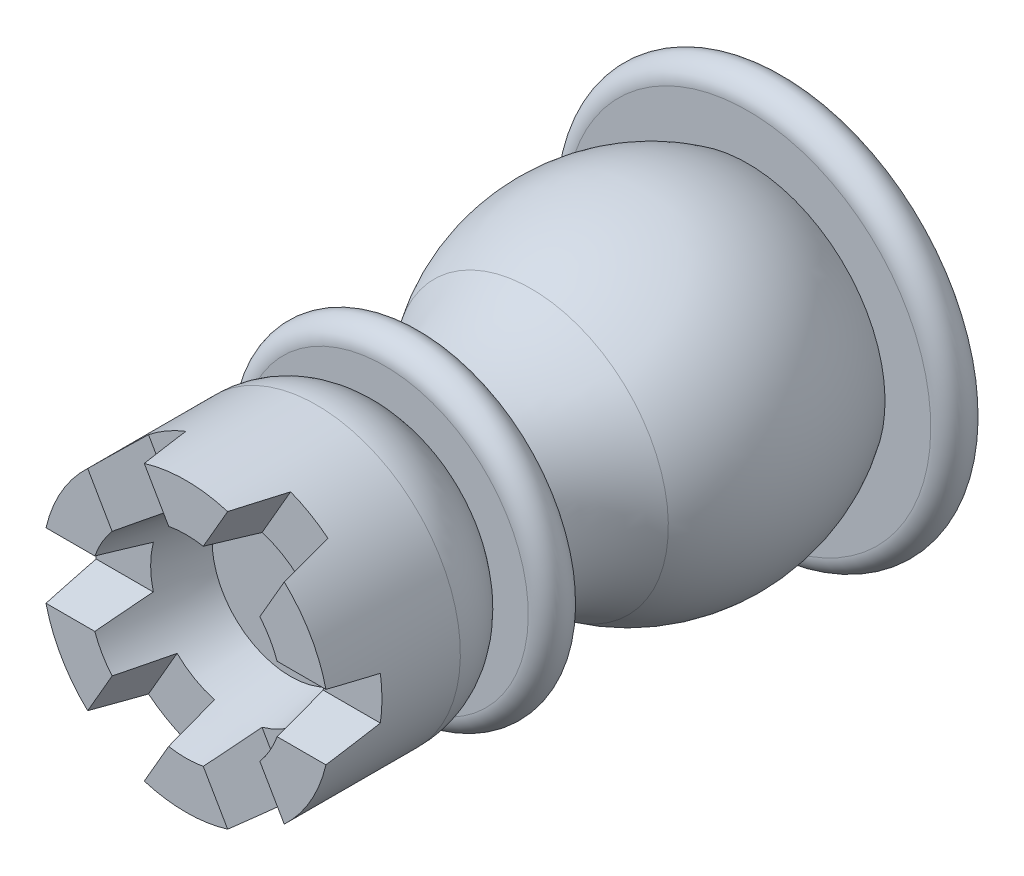
ISO-10303-21;
HEADER;
FILE_DESCRIPTION(('STEP AP214'),'2;1');
FILE_NAME('part.step','',(''),(''),'','','');
FILE_SCHEMA(('AUTOMOTIVE_DESIGN { 1 0 10303 214 1 1 1 1 }'));
ENDSEC;
DATA;
#1=APPLICATION_CONTEXT('core data for automotive mechanical design processes');
#2=APPLICATION_PROTOCOL_DEFINITION('international standard','automotive_design',2000,#1);
#3=PRODUCT_CONTEXT('',#1,'mechanical');
#4=PRODUCT('Part','Part','',(#3));
#5=PRODUCT_RELATED_PRODUCT_CATEGORY('part','',(#4));
#6=PRODUCT_DEFINITION_FORMATION('','',#4);
#7=PRODUCT_DEFINITION_CONTEXT('part definition',#1,'design');
#8=PRODUCT_DEFINITION('design','',#6,#7);
#9=PRODUCT_DEFINITION_SHAPE('','',#8);
#10=(LENGTH_UNIT() NAMED_UNIT(*) SI_UNIT(.MILLI.,.METRE.));
#11=(NAMED_UNIT(*) PLANE_ANGLE_UNIT() SI_UNIT($,.RADIAN.));
#12=(NAMED_UNIT(*) SI_UNIT($,.STERADIAN.) SOLID_ANGLE_UNIT());
#13=UNCERTAINTY_MEASURE_WITH_UNIT(LENGTH_MEASURE(1.E-05),#10,'distance_accuracy_value','');
#14=(GEOMETRIC_REPRESENTATION_CONTEXT(3) GLOBAL_UNCERTAINTY_ASSIGNED_CONTEXT((#13)) GLOBAL_UNIT_ASSIGNED_CONTEXT((#10,
#11,#12)) REPRESENTATION_CONTEXT('',''));
#15=CARTESIAN_POINT('',(0.,0.,0.));
#16=DIRECTION('',(0.,0.,1.));
#17=DIRECTION('',(1.,0.,0.));
#18=AXIS2_PLACEMENT_3D('',#15,#16,#17);
#19=CARTESIAN_POINT('',(0.,11.,46.));
#20=DIRECTION('',(0.,0.,-1.));
#21=DIRECTION('',(0.,1.,0.));
#22=AXIS2_PLACEMENT_3D('',#19,#20,#21);
#23=PLANE('',#22);
#24=DIRECTION('',(0.499999999999998,0.86602540378444,0.));
#25=VECTOR('',#24,1.);
#26=CARTESIAN_POINT('',(-8.42163336986825,-19.5866968793294,46.));
#27=LINE('',#26,#25);
#28=CARTESIAN_POINT('',(-3.19100781194602,-10.5269876576397,46.));
#29=VERTEX_POINT('',#28);
#30=CARTESIAN_POINT('',(-1.32303150114498,-7.29155777999727,46.));
#31=VERTEX_POINT('',#30);
#32=EDGE_CURVE('E218',#29,#31,#27,.T.);
#33=ORIENTED_EDGE('',*,*,#32,.F.);
#34=CARTESIAN_POINT('',(0.,0.,46.));
#35=DIRECTION('',(0.,0.,1.));
#36=DIRECTION('',(0.,-1.,0.));
#37=AXIS2_PLACEMENT_3D('',#34,#35,#36);
#38=CIRCLE('',#37,11.);
#39=CARTESIAN_POINT('',(3.19100781194609,-10.5269876576397,46.));
#40=VERTEX_POINT('',#39);
#41=EDGE_CURVE('E239',#29,#40,#38,.T.);
#42=ORIENTED_EDGE('',*,*,#41,.T.);
#43=DIRECTION('',(-0.500000000000004,0.866025403784436,0.));
#44=VECTOR('',#43,1.);
#45=CARTESIAN_POINT('',(8.42163336986841,-19.5866968793294,46.));
#46=LINE('',#45,#44);
#47=CARTESIAN_POINT('',(1.32303150114501,-7.29155777999722,46.));
#48=VERTEX_POINT('',#47);
#49=EDGE_CURVE('E465',#40,#48,#46,.T.);
#50=ORIENTED_EDGE('',*,*,#49,.T.);
#51=CARTESIAN_POINT('',(0.,0.,46.));
#52=DIRECTION('',(0.,0.,1.));
#53=DIRECTION('',(0.,-1.,0.));
#54=AXIS2_PLACEMENT_3D('',#51,#52,#53);
#55=CIRCLE('',#54,7.41061584566766);
#56=EDGE_CURVE('E253',#31,#48,#55,.T.);
#57=ORIENTED_EDGE('',*,*,#56,.F.);
#58=EDGE_LOOP('',(#33,#42,#50,#57));
#59=FACE_BOUND('',#58,.T.);
#60=ADVANCED_FACE('F44',(#59),#23,.F.);
#61=DIRECTION('',(-0.500000000000004,0.866025403784436,0.));
#62=VECTOR('',#61,1.);
#63=CARTESIAN_POINT('',(12.7517603887906,-17.0866968793294,46.));
#64=LINE('',#63,#62);
#65=CARTESIAN_POINT('',(7.52113483086827,-8.0269876576397,46.));
#66=VERTEX_POINT('',#65);
#67=CARTESIAN_POINT('',(5.65315852006721,-4.79155777999723,46.));
#68=VERTEX_POINT('',#67);
#69=EDGE_CURVE('E209',#66,#68,#64,.T.);
#70=ORIENTED_EDGE('',*,*,#69,.F.);
#71=CARTESIAN_POINT('',(10.7121426428143,-2.5,46.));
#72=VERTEX_POINT('',#71);
#73=EDGE_CURVE('E223',#66,#72,#38,.T.);
#74=ORIENTED_EDGE('',*,*,#73,.T.);
#75=DIRECTION('',(1.,0.,0.));
#76=VECTOR('',#75,1.);
#77=CARTESIAN_POINT('',(-15.5,-2.5,46.));
#78=LINE('',#77,#76);
#79=CARTESIAN_POINT('',(6.9761900212122,-2.5,46.));
#80=VERTEX_POINT('',#79);
#81=EDGE_CURVE('E317',#80,#72,#78,.T.);
#82=ORIENTED_EDGE('',*,*,#81,.F.);
#83=EDGE_CURVE('E230',#68,#80,#55,.T.);
#84=ORIENTED_EDGE('',*,*,#83,.F.);
#85=EDGE_LOOP('',(#70,#74,#82,#84));
#86=FACE_BOUND('',#85,.T.);
#87=ADVANCED_FACE('F224',(#86),#23,.F.);
#88=CARTESIAN_POINT('',(5.65315852006718,4.79155777999728,46.));
#89=VERTEX_POINT('',#88);
#90=CARTESIAN_POINT('',(7.52113483086821,8.02698765763974,46.));
#91=VERTEX_POINT('',#90);
#92=EDGE_CURVE('E453',#89,#91,#27,.T.);
#93=ORIENTED_EDGE('',*,*,#92,.F.);
#94=CARTESIAN_POINT('',(6.97619002121224,2.5,46.));
#95=VERTEX_POINT('',#94);
#96=EDGE_CURVE('E238',#95,#89,#55,.T.);
#97=ORIENTED_EDGE('',*,*,#96,.F.);
#98=DIRECTION('',(1.,0.,0.));
#99=VECTOR('',#98,1.);
#100=CARTESIAN_POINT('',(-15.5,2.5,46.));
#101=LINE('',#100,#99);
#102=CARTESIAN_POINT('',(10.7121426428143,2.5,46.));
#103=VERTEX_POINT('',#102);
#104=EDGE_CURVE('E322',#95,#103,#101,.T.);
#105=ORIENTED_EDGE('',*,*,#104,.T.);
#106=EDGE_CURVE('E254',#103,#91,#38,.T.);
#107=ORIENTED_EDGE('',*,*,#106,.T.);
#108=EDGE_LOOP('',(#93,#97,#105,#107));
#109=FACE_BOUND('',#108,.T.);
#110=ADVANCED_FACE('F500',(#109),#23,.F.);
#111=CARTESIAN_POINT('',(1.32303150114497,7.29155777999723,46.));
#112=VERTEX_POINT('',#111);
#113=CARTESIAN_POINT('',(-1.32303150114503,7.29155777999726,46.));
#114=VERTEX_POINT('',#113);
#115=EDGE_CURVE('E246',#112,#114,#55,.T.);
#116=ORIENTED_EDGE('',*,*,#115,.F.);
#117=DIRECTION('',(0.499999999999998,0.86602540378444,0.));
#118=VECTOR('',#117,1.);
#119=CARTESIAN_POINT('',(-12.7517603887905,-17.0866968793294,46.));
#120=LINE('',#119,#118);
#121=CARTESIAN_POINT('',(3.19100781194601,10.5269876576397,46.));
#122=VERTEX_POINT('',#121);
#123=EDGE_CURVE('E282',#112,#122,#120,.T.);
#124=ORIENTED_EDGE('',*,*,#123,.T.);
#125=CARTESIAN_POINT('',(-3.19100781194609,10.5269876576397,46.));
#126=VERTEX_POINT('',#125);
#127=EDGE_CURVE('E261',#122,#126,#38,.T.);
#128=ORIENTED_EDGE('',*,*,#127,.T.);
#129=EDGE_CURVE('E228',#114,#126,#64,.T.);
#130=ORIENTED_EDGE('',*,*,#129,.F.);
#131=EDGE_LOOP('',(#116,#124,#128,#130));
#132=FACE_BOUND('',#131,.T.);
#133=ADVANCED_FACE('F276',(#132),#23,.F.);
#134=CARTESIAN_POINT('',(-10.7121426428143,-2.5,46.));
#135=VERTEX_POINT('',#134);
#136=CARTESIAN_POINT('',(-7.52113483086822,-8.02698765763975,46.));
#137=VERTEX_POINT('',#136);
#138=EDGE_CURVE('E245',#135,#137,#38,.T.);
#139=ORIENTED_EDGE('',*,*,#138,.T.);
#140=CARTESIAN_POINT('',(-5.65315852006718,-4.79155777999728,46.));
#141=VERTEX_POINT('',#140);
#142=EDGE_CURVE('E449',#137,#141,#120,.T.);
#143=ORIENTED_EDGE('',*,*,#142,.T.);
#144=CARTESIAN_POINT('',(-6.9761900212122,-2.5,46.));
#145=VERTEX_POINT('',#144);
#146=EDGE_CURVE('E249',#145,#141,#55,.T.);
#147=ORIENTED_EDGE('',*,*,#146,.F.);
#148=EDGE_CURVE('E325',#135,#145,#78,.T.);
#149=ORIENTED_EDGE('',*,*,#148,.F.);
#150=EDGE_LOOP('',(#139,#143,#147,#149));
#151=FACE_BOUND('',#150,.T.);
#152=ADVANCED_FACE('F502',(#151),#23,.F.);
#153=CARTESIAN_POINT('',(0.,0.,0.));
#154=DIRECTION('',(0.,0.,1.));
#155=DIRECTION('',(0.,-1.,0.));
#156=AXIS2_PLACEMENT_3D('',#153,#154,#155);
#157=PLANE('',#156);
#158=CARTESIAN_POINT('',(0.,0.,0.));
#159=DIRECTION('',(0.,0.,1.));
#160=DIRECTION('',(0.,-1.,0.));
#161=AXIS2_PLACEMENT_3D('',#158,#159,#160);
#162=CIRCLE('',#161,14.);
#163=CARTESIAN_POINT('',(0.,-14.,0.));
#164=VERTEX_POINT('',#163);
#165=EDGE_CURVE('E541',#164,#164,#162,.T.);
#166=ORIENTED_EDGE('',*,*,#165,.F.);
#167=EDGE_LOOP('',(#166));
#168=FACE_BOUND('',#167,.T.);
#169=ADVANCED_FACE('F50',(#168),#157,.F.);
#170=CARTESIAN_POINT('',(0.,0.,1.5));
#171=DIRECTION('',(0.,0.,1.));
#172=DIRECTION('',(0.,-1.,0.));
#173=AXIS2_PLACEMENT_3D('',#170,#171,#172);
#174=TOROIDAL_SURFACE('',#173,14.,1.5);
#175=CARTESIAN_POINT('',(0.,0.,3.));
#176=DIRECTION('',(0.,0.,1.));
#177=DIRECTION('',(0.,-1.,0.));
#178=AXIS2_PLACEMENT_3D('',#175,#176,#177);
#179=CIRCLE('',#178,14.);
#180=CARTESIAN_POINT('',(0.,-14.,3.));
#181=VERTEX_POINT('',#180);
#182=EDGE_CURVE('E542',#181,#181,#179,.T.);
#183=ORIENTED_EDGE('',*,*,#182,.F.);
#184=EDGE_LOOP('',(#183));
#185=FACE_BOUND('',#184,.T.);
#186=ORIENTED_EDGE('',*,*,#165,.T.);
#187=EDGE_LOOP('',(#186));
#188=FACE_BOUND('',#187,.T.);
#189=ADVANCED_FACE('F511',(#185,#188),#174,.T.);
#190=CARTESIAN_POINT('',(0.,14.,3.));
#191=DIRECTION('',(0.,0.,-1.));
#192=DIRECTION('',(0.,1.,0.));
#193=AXIS2_PLACEMENT_3D('',#190,#191,#192);
#194=PLANE('',#193);
#195=CARTESIAN_POINT('',(0.,0.,3.));
#196=DIRECTION('',(0.,0.,1.));
#197=DIRECTION('',(0.,-1.,0.));
#198=AXIS2_PLACEMENT_3D('',#195,#196,#197);
#199=CIRCLE('',#198,10.5);
#200=CARTESIAN_POINT('',(0.,-10.5,3.));
#201=VERTEX_POINT('',#200);
#202=EDGE_CURVE('E549',#201,#201,#199,.T.);
#203=ORIENTED_EDGE('',*,*,#202,.F.);
#204=EDGE_LOOP('',(#203));
#205=FACE_BOUND('',#204,.T.);
#206=ORIENTED_EDGE('',*,*,#182,.T.);
#207=EDGE_LOOP('',(#206));
#208=FACE_BOUND('',#207,.T.);
#209=ADVANCED_FACE('F605',(#205,#208),#194,.F.);
#210=CARTESIAN_POINT('',(0.,0.,11.2915619761802));
#211=DIRECTION('',(0.,0.,1.));
#212=DIRECTION('',(0.,-1.,0.));
#213=AXIS2_PLACEMENT_3D('',#210,#211,#212);
#214=DEGENERATE_TOROIDAL_SURFACE('',#213,1.99999999980648,15.,.F.);
#215=CARTESIAN_POINT('',(0.,0.,19.5832509410501));
#216=DIRECTION('',(0.,0.,1.));
#217=DIRECTION('',(0.,-1.,0.));
#218=AXIS2_PLACEMENT_3D('',#215,#216,#217);
#219=CIRCLE('',#218,10.4999157643039);
#220=CARTESIAN_POINT('',(0.,-10.4999157643039,19.5832509410501));
#221=VERTEX_POINT('',#220);
#222=EDGE_CURVE('E551',#221,#221,#219,.T.);
#223=ORIENTED_EDGE('',*,*,#222,.F.);
#224=EDGE_LOOP('',(#223));
#225=FACE_BOUND('',#224,.T.);
#226=ORIENTED_EDGE('',*,*,#202,.T.);
#227=EDGE_LOOP('',(#226));
#228=FACE_BOUND('',#227,.T.);
#229=ADVANCED_FACE('F596',(#225,#228),#214,.F.);
#230=CARTESIAN_POINT('',(0.,0.,27.87493990592));
#231=DIRECTION('',(0.,0.,1.));
#232=DIRECTION('',(0.,-1.,0.));
#233=AXIS2_PLACEMENT_3D('',#230,#231,#232);
#234=TOROIDAL_SURFACE('',#233,22.9998315284143,15.);
#235=CARTESIAN_POINT('',(0.,0.,27.8038475772934));
#236=DIRECTION('',(0.,0.,1.));
#237=DIRECTION('',(0.,-1.,0.));
#238=AXIS2_PLACEMENT_3D('',#235,#236,#237);
#239=CIRCLE('',#238,8.);
#240=CARTESIAN_POINT('',(0.,-8.,27.8038475772934));
#241=VERTEX_POINT('',#240);
#242=EDGE_CURVE('E559',#241,#241,#239,.T.);
#243=ORIENTED_EDGE('',*,*,#242,.F.);
#244=EDGE_LOOP('',(#243));
#245=FACE_BOUND('',#244,.T.);
#246=ORIENTED_EDGE('',*,*,#222,.T.);
#247=EDGE_LOOP('',(#246));
#248=FACE_BOUND('',#247,.T.);
#249=ADVANCED_FACE('F587',(#245,#248),#234,.F.);
#250=CARTESIAN_POINT('',(0.,8.,27.8038475772934));
#251=DIRECTION('',(0.,0.,1.));
#252=DIRECTION('',(0.,-1.,0.));
#253=AXIS2_PLACEMENT_3D('',#250,#251,#252);
#254=PLANE('',#253);
#255=CARTESIAN_POINT('',(0.,0.,27.8038475772934));
#256=DIRECTION('',(0.,0.,1.));
#257=DIRECTION('',(0.,-1.,0.));
#258=AXIS2_PLACEMENT_3D('',#255,#256,#257);
#259=CIRCLE('',#258,11.);
#260=CARTESIAN_POINT('',(0.,-11.,27.8038475772934));
#261=VERTEX_POINT('',#260);
#262=EDGE_CURVE('E565',#261,#261,#259,.T.);
#263=ORIENTED_EDGE('',*,*,#262,.F.);
#264=EDGE_LOOP('',(#263));
#265=FACE_BOUND('',#264,.T.);
#266=ORIENTED_EDGE('',*,*,#242,.T.);
#267=EDGE_LOOP('',(#266));
#268=FACE_BOUND('',#267,.T.);
#269=ADVANCED_FACE('F585',(#265,#268),#254,.F.);
#270=CARTESIAN_POINT('',(0.,0.,29.3038475772934));
#271=DIRECTION('',(0.,0.,1.));
#272=DIRECTION('',(0.,-1.,0.));
#273=AXIS2_PLACEMENT_3D('',#270,#271,#272);
#274=TOROIDAL_SURFACE('',#273,11.,1.5);
#275=CARTESIAN_POINT('',(0.,0.,30.8038475772934));
#276=DIRECTION('',(0.,0.,1.));
#277=DIRECTION('',(0.,-1.,0.));
#278=AXIS2_PLACEMENT_3D('',#275,#276,#277);
#279=CIRCLE('',#278,11.);
#280=CARTESIAN_POINT('',(0.,-11.,30.8038475772934));
#281=VERTEX_POINT('',#280);
#282=EDGE_CURVE('E567',#281,#281,#279,.T.);
#283=ORIENTED_EDGE('',*,*,#282,.F.);
#284=EDGE_LOOP('',(#283));
#285=FACE_BOUND('',#284,.T.);
#286=ORIENTED_EDGE('',*,*,#262,.T.);
#287=EDGE_LOOP('',(#286));
#288=FACE_BOUND('',#287,.T.);
#289=ADVANCED_FACE('F576',(#285,#288),#274,.T.);
#290=CARTESIAN_POINT('',(0.,11.,30.8038475772934));
#291=DIRECTION('',(0.,0.,-1.));
#292=DIRECTION('',(0.,1.,0.));
#293=AXIS2_PLACEMENT_3D('',#290,#291,#292);
#294=PLANE('',#293);
#295=CARTESIAN_POINT('',(0.,0.,30.8038475772934));
#296=DIRECTION('',(0.,0.,1.));
#297=DIRECTION('',(0.,-1.,0.));
#298=AXIS2_PLACEMENT_3D('',#295,#296,#297);
#299=CIRCLE('',#298,8.);
#300=CARTESIAN_POINT('',(0.,-8.,30.8038475772934));
#301=VERTEX_POINT('',#300);
#302=EDGE_CURVE('E275',#301,#301,#299,.T.);
#303=ORIENTED_EDGE('',*,*,#302,.F.);
#304=EDGE_LOOP('',(#303));
#305=FACE_BOUND('',#304,.T.);
#306=ORIENTED_EDGE('',*,*,#282,.T.);
#307=EDGE_LOOP('',(#306));
#308=FACE_BOUND('',#307,.T.);
#309=ADVANCED_FACE('F573',(#305,#308),#294,.F.);
#310=CARTESIAN_POINT('',(0.,0.,36.));
#311=DIRECTION('',(0.,0.,1.));
#312=DIRECTION('',(0.,-1.,0.));
#313=AXIS2_PLACEMENT_3D('',#310,#311,#312);
#314=DEGENERATE_TOROIDAL_SURFACE('',#313,5.,6.,.T.);
#315=CARTESIAN_POINT('',(0.,0.,36.));
#316=DIRECTION('',(0.,0.,1.));
#317=DIRECTION('',(0.,-1.,0.));
#318=AXIS2_PLACEMENT_3D('',#315,#316,#317);
#319=CIRCLE('',#318,11.);
#320=CARTESIAN_POINT('',(0.,-11.,36.));
#321=VERTEX_POINT('',#320);
#322=EDGE_CURVE('E262',#321,#321,#319,.T.);
#323=ORIENTED_EDGE('',*,*,#322,.F.);
#324=EDGE_LOOP('',(#323));
#325=FACE_BOUND('',#324,.T.);
#326=ORIENTED_EDGE('',*,*,#302,.T.);
#327=EDGE_LOOP('',(#326));
#328=FACE_BOUND('',#327,.T.);
#329=ADVANCED_FACE('F510',(#325,#328),#314,.T.);
#330=CARTESIAN_POINT('',(0.,0.,46.));
#331=DIRECTION('',(0.,0.,1.));
#332=DIRECTION('',(0.,-1.,0.));
#333=AXIS2_PLACEMENT_3D('',#330,#331,#332);
#334=CYLINDRICAL_SURFACE('',#333,11.);
#335=CARTESIAN_POINT('',(0.,0.,42.));
#336=DIRECTION('',(0.,0.,-1.));
#337=DIRECTION('',(-1.,0.,0.));
#338=AXIS2_PLACEMENT_3D('',#335,#336,#337);
#339=CIRCLE('',#338,11.);
#340=CARTESIAN_POINT('',(4.00904416225743,10.2434156854571,42.));
#341=VERTEX_POINT('',#340);
#342=CARTESIAN_POINT('',(6.86653612400112,8.59364193213725,42.));
#343=VERTEX_POINT('',#342);
#344=EDGE_CURVE('E301',#341,#343,#339,.T.);
#345=ORIENTED_EDGE('',*,*,#344,.T.);
#346=CARTESIAN_POINT('',(0.,0.,34.2384247263039));
#347=DIRECTION('',(0.847100670886275,-0.489073800366901,-0.20791169081776));
#348=DIRECTION('',(0.180056805991956,-0.10395584540888,0.978147600733805));
#349=AXIS2_PLACEMENT_3D('',#346,#347,#348);
#350=ELLIPSE('',#349,52.9070777921853,11.);
#351=EDGE_CURVE('E314',#343,#91,#350,.T.);
#352=ORIENTED_EDGE('',*,*,#351,.T.);
#353=ORIENTED_EDGE('',*,*,#106,.F.);
#354=CARTESIAN_POINT('',(0.,0.,34.2384247263039));
#355=DIRECTION('',(0.,0.978147600733806,-0.20791169081776));
#356=DIRECTION('',(0.,0.20791169081776,0.978147600733806));
#357=AXIS2_PLACEMENT_3D('',#354,#355,#356);
#358=ELLIPSE('',#357,52.9070777921853,11.);
#359=CARTESIAN_POINT('',(10.8755802862586,1.64977375331991,42.));
#360=VERTEX_POINT('',#359);
#361=EDGE_CURVE('E344',#103,#360,#358,.T.);
#362=ORIENTED_EDGE('',*,*,#361,.T.);
#363=CARTESIAN_POINT('',(0.,0.,42.));
#364=DIRECTION('',(0.,0.,-1.));
#365=DIRECTION('',(-1.,0.,0.));
#366=AXIS2_PLACEMENT_3D('',#363,#364,#365);
#367=CIRCLE('',#366,11.);
#368=CARTESIAN_POINT('',(10.8755802862586,-1.64977375331991,42.));
#369=VERTEX_POINT('',#368);
#370=EDGE_CURVE('E338',#360,#369,#367,.T.);
#371=ORIENTED_EDGE('',*,*,#370,.T.);
#372=CARTESIAN_POINT('',(0.,0.,34.2384247263039));
#373=DIRECTION('',(0.,-0.978147600733806,-0.20791169081776));
#374=DIRECTION('',(0.,-0.20791169081776,0.978147600733805));
#375=AXIS2_PLACEMENT_3D('',#372,#373,#374);
#376=ELLIPSE('',#375,52.9070777921853,11.);
#377=EDGE_CURVE('E240',#369,#72,#376,.T.);
#378=ORIENTED_EDGE('',*,*,#377,.T.);
#379=ORIENTED_EDGE('',*,*,#73,.F.);
#380=CARTESIAN_POINT('',(0.,0.,34.2384247263039));
#381=DIRECTION('',(0.847100670886272,0.489073800366907,-0.20791169081776));
#382=DIRECTION('',(0.180056805991955,0.103955845408881,0.978147600733805));
#383=AXIS2_PLACEMENT_3D('',#380,#381,#382);
#384=ELLIPSE('',#383,52.9070777921853,11.);
#385=CARTESIAN_POINT('',(6.86653612400118,-8.59364193213719,42.));
#386=VERTEX_POINT('',#385);
#387=EDGE_CURVE('E210',#66,#386,#384,.T.);
#388=ORIENTED_EDGE('',*,*,#387,.T.);
#389=CARTESIAN_POINT('',(4.00904416225751,-10.2434156854571,42.));
#390=VERTEX_POINT('',#389);
#391=EDGE_CURVE('E429',#386,#390,#339,.T.);
#392=ORIENTED_EDGE('',*,*,#391,.T.);
#393=CARTESIAN_POINT('',(0.,0.,34.2384247263039));
#394=DIRECTION('',(-0.847100670886272,-0.489073800366907,-0.20791169081776));
#395=DIRECTION('',(-0.180056805991955,-0.103955845408881,0.978147600733806));
#396=AXIS2_PLACEMENT_3D('',#393,#394,#395);
#397=ELLIPSE('',#396,52.9070777921853,11.);
#398=EDGE_CURVE('E217',#390,#40,#397,.T.);
#399=ORIENTED_EDGE('',*,*,#398,.T.);
#400=ORIENTED_EDGE('',*,*,#41,.F.);
#401=CARTESIAN_POINT('',(0.,0.,34.2384247263039));
#402=DIRECTION('',(0.847100670886275,-0.489073800366901,-0.20791169081776));
#403=DIRECTION('',(0.180056805991956,-0.10395584540888,0.978147600733805));
#404=AXIS2_PLACEMENT_3D('',#401,#402,#403);
#405=ELLIPSE('',#404,52.9070777921853,11.);
#406=CARTESIAN_POINT('',(-4.00904416225744,-10.2434156854571,42.));
#407=VERTEX_POINT('',#406);
#408=EDGE_CURVE('E308',#29,#407,#405,.T.);
#409=ORIENTED_EDGE('',*,*,#408,.T.);
#410=CARTESIAN_POINT('',(-6.86653612400112,-8.59364193213725,42.));
#411=VERTEX_POINT('',#410);
#412=EDGE_CURVE('E297',#407,#411,#339,.T.);
#413=ORIENTED_EDGE('',*,*,#412,.T.);
#414=CARTESIAN_POINT('',(0.,0.,34.2384247263039));
#415=DIRECTION('',(-0.847100670886275,0.489073800366901,-0.20791169081776));
#416=DIRECTION('',(-0.180056805991956,0.103955845408879,0.978147600733806));
#417=AXIS2_PLACEMENT_3D('',#414,#415,#416);
#418=ELLIPSE('',#417,52.9070777921853,11.);
#419=EDGE_CURVE('E309',#411,#137,#418,.T.);
#420=ORIENTED_EDGE('',*,*,#419,.T.);
#421=ORIENTED_EDGE('',*,*,#138,.F.);
#422=CARTESIAN_POINT('',(-10.8755802862586,-1.64977375331991,42.));
#423=VERTEX_POINT('',#422);
#424=EDGE_CURVE('E346',#135,#423,#376,.T.);
#425=ORIENTED_EDGE('',*,*,#424,.T.);
#426=CARTESIAN_POINT('',(-10.8755802862586,1.64977375331991,42.));
#427=VERTEX_POINT('',#426);
#428=EDGE_CURVE('E337',#423,#427,#367,.T.);
#429=ORIENTED_EDGE('',*,*,#428,.T.);
#430=CARTESIAN_POINT('',(-10.7121426428143,2.5,46.));
#431=VERTEX_POINT('',#430);
#432=EDGE_CURVE('E343',#427,#431,#358,.T.);
#433=ORIENTED_EDGE('',*,*,#432,.T.);
#434=CARTESIAN_POINT('',(-7.52113483086827,8.02698765763971,46.));
#435=VERTEX_POINT('',#434);
#436=EDGE_CURVE('E248',#435,#431,#38,.T.);
#437=ORIENTED_EDGE('',*,*,#436,.F.);
#438=CARTESIAN_POINT('',(0.,0.,34.2384247263039));
#439=DIRECTION('',(-0.847100670886272,-0.489073800366907,-0.20791169081776));
#440=DIRECTION('',(-0.180056805991955,-0.103955845408881,0.978147600733806));
#441=AXIS2_PLACEMENT_3D('',#438,#439,#440);
#442=ELLIPSE('',#441,52.9070777921853,11.);
#443=CARTESIAN_POINT('',(-6.86653612400118,8.5936419321372,42.));
#444=VERTEX_POINT('',#443);
#445=EDGE_CURVE('E295',#435,#444,#442,.T.);
#446=ORIENTED_EDGE('',*,*,#445,.T.);
#447=CARTESIAN_POINT('',(-4.00904416225751,10.2434156854571,42.));
#448=VERTEX_POINT('',#447);
#449=EDGE_CURVE('E286',#444,#448,#339,.T.);
#450=ORIENTED_EDGE('',*,*,#449,.T.);
#451=CARTESIAN_POINT('',(0.,0.,34.2384247263039));
#452=DIRECTION('',(0.847100670886272,0.489073800366907,-0.20791169081776));
#453=DIRECTION('',(0.180056805991955,0.103955845408881,0.978147600733805));
#454=AXIS2_PLACEMENT_3D('',#451,#452,#453);
#455=ELLIPSE('',#454,52.9070777921853,11.);
#456=EDGE_CURVE('E288',#448,#126,#455,.T.);
#457=ORIENTED_EDGE('',*,*,#456,.T.);
#458=ORIENTED_EDGE('',*,*,#127,.F.);
#459=CARTESIAN_POINT('',(0.,0.,34.2384247263039));
#460=DIRECTION('',(-0.847100670886275,0.489073800366901,-0.20791169081776));
#461=DIRECTION('',(-0.180056805991956,0.103955845408879,0.978147600733806));
#462=AXIS2_PLACEMENT_3D('',#459,#460,#461);
#463=ELLIPSE('',#462,52.9070777921853,11.);
#464=EDGE_CURVE('E281',#122,#341,#463,.T.);
#465=ORIENTED_EDGE('',*,*,#464,.T.);
#466=EDGE_LOOP('',(#345,#352,#353,#362,#371,#378,#379,#388,#392,#399,#400,#409,#413,#420,#421,
#425,#429,#433,#437,#446,#450,#457,#458,#465));
#467=FACE_BOUND('',#466,.T.);
#468=ORIENTED_EDGE('',*,*,#322,.T.);
#469=EDGE_LOOP('',(#468));
#470=FACE_BOUND('',#469,.T.);
#471=ADVANCED_FACE('F232',(#467,#470),#334,.T.);
#472=CARTESIAN_POINT('',(-5.6531585200672,4.79155777999722,46.));
#473=VERTEX_POINT('',#472);
#474=CARTESIAN_POINT('',(-6.97619002121224,2.5,46.));
#475=VERTEX_POINT('',#474);
#476=EDGE_CURVE('E351',#473,#475,#55,.T.);
#477=ORIENTED_EDGE('',*,*,#476,.F.);
#478=EDGE_CURVE('E420',#473,#435,#46,.T.);
#479=ORIENTED_EDGE('',*,*,#478,.T.);
#480=ORIENTED_EDGE('',*,*,#436,.T.);
#481=EDGE_CURVE('E323',#431,#475,#101,.T.);
#482=ORIENTED_EDGE('',*,*,#481,.T.);
#483=EDGE_LOOP('',(#477,#479,#480,#482));
#484=FACE_BOUND('',#483,.T.);
#485=ADVANCED_FACE('F416',(#484),#23,.F.);
#486=CARTESIAN_POINT('',(0.,0.,46.));
#487=DIRECTION('',(0.,0.,1.));
#488=DIRECTION('',(0.,-1.,0.));
#489=AXIS2_PLACEMENT_3D('',#486,#487,#488);
#490=CONICAL_SURFACE('',#489,7.41061584566766,0.174532925199426);
#491=ORIENTED_EDGE('',*,*,#146,.T.);
#492=CARTESIAN_POINT('',(-12.2946594059957,7.09832491764633,101.028410995144));
#493=DIRECTION('',(-0.847100670886275,0.489073800366901,-0.20791169081776));
#494=DIRECTION('',(-0.180056805991956,0.103955845408879,0.978147600733805));
#495=AXIS2_PLACEMENT_3D('',#492,#493,#494);
#496=ELLIPSE('',#495,82.3119149400116,9.55671284905567);
#497=CARTESIAN_POINT('',(-4.67833829772001,-4.80357212000657,42.));
#498=VERTEX_POINT('',#497);
#499=EDGE_CURVE('E11',#141,#498,#496,.F.);
#500=ORIENTED_EDGE('',*,*,#499,.T.);
#501=CARTESIAN_POINT('',(0.,0.,42.));
#502=DIRECTION('',(0.,0.,-1.));
#503=DIRECTION('',(-1.,0.,0.));
#504=AXIS2_PLACEMENT_3D('',#501,#502,#503);
#505=CIRCLE('',#504,6.70530792283383);
#506=CARTESIAN_POINT('',(-1.82084633597632,-6.45334587332647,42.));
#507=VERTEX_POINT('',#506);
#508=EDGE_CURVE('E383',#498,#507,#505,.F.);
#509=ORIENTED_EDGE('',*,*,#508,.T.);
#510=CARTESIAN_POINT('',(12.2946594059957,-7.09832491764632,101.028410995144));
#511=DIRECTION('',(0.847100670886275,-0.489073800366901,-0.20791169081776));
#512=DIRECTION('',(0.180056805991956,-0.10395584540888,0.978147600733805));
#513=AXIS2_PLACEMENT_3D('',#510,#511,#512);
#514=ELLIPSE('',#513,82.3119149400117,9.55671284905568);
#515=EDGE_CURVE('E53',#507,#31,#514,.F.);
#516=ORIENTED_EDGE('',*,*,#515,.T.);
#517=ORIENTED_EDGE('',*,*,#56,.T.);
#518=CARTESIAN_POINT('',(-12.2946594059956,-7.09832491764641,101.028410995144));
#519=DIRECTION('',(-0.847100670886272,-0.489073800366907,-0.20791169081776));
#520=DIRECTION('',(-0.180056805991955,-0.103955845408881,0.978147600733805));
#521=AXIS2_PLACEMENT_3D('',#518,#519,#520);
#522=ELLIPSE('',#521,82.3119149400116,9.55671284905567);
#523=CARTESIAN_POINT('',(1.82084633597634,-6.45334587332641,42.));
#524=VERTEX_POINT('',#523);
#525=EDGE_CURVE('E397',#48,#524,#522,.F.);
#526=ORIENTED_EDGE('',*,*,#525,.T.);
#527=CARTESIAN_POINT('',(4.67833829772003,-4.80357212000651,42.));
#528=VERTEX_POINT('',#527);
#529=EDGE_CURVE('E391',#524,#528,#505,.F.);
#530=ORIENTED_EDGE('',*,*,#529,.T.);
#531=CARTESIAN_POINT('',(12.2946594059956,7.09832491764641,101.028410995144));
#532=DIRECTION('',(0.847100670886272,0.489073800366907,-0.20791169081776));
#533=DIRECTION('',(0.180056805991955,0.103955845408881,0.978147600733805));
#534=AXIS2_PLACEMENT_3D('',#531,#532,#533);
#535=ELLIPSE('',#534,82.3119149400117,9.55671284905569);
#536=EDGE_CURVE('E399',#528,#68,#535,.F.);
#537=ORIENTED_EDGE('',*,*,#536,.T.);
#538=ORIENTED_EDGE('',*,*,#83,.T.);
#539=CARTESIAN_POINT('',(0.,-14.196649835293,101.028410995146));
#540=DIRECTION('',(0.,-0.978147600733806,-0.20791169081776));
#541=DIRECTION('',(0.,-0.20791169081776,0.978147600733805));
#542=AXIS2_PLACEMENT_3D('',#539,#540,#541);
#543=ELLIPSE('',#542,82.3119149400138,9.5567128490558);
#544=CARTESIAN_POINT('',(6.49918463369636,-1.64977375331991,42.));
#545=VERTEX_POINT('',#544);
#546=EDGE_CURVE('E401',#80,#545,#543,.F.);
#547=ORIENTED_EDGE('',*,*,#546,.T.);
#548=CARTESIAN_POINT('',(0.,0.,42.));
#549=DIRECTION('',(0.,0.,-1.));
#550=DIRECTION('',(-1.,0.,0.));
#551=AXIS2_PLACEMENT_3D('',#548,#549,#550);
#552=CIRCLE('',#551,6.70530792283383);
#553=CARTESIAN_POINT('',(6.49918463369636,1.64977375331991,42.));
#554=VERTEX_POINT('',#553);
#555=EDGE_CURVE('E528',#545,#554,#552,.F.);
#556=ORIENTED_EDGE('',*,*,#555,.T.);
#557=CARTESIAN_POINT('',(0.,14.196649835293,101.028410995146));
#558=DIRECTION('',(0.,0.978147600733806,-0.20791169081776));
#559=DIRECTION('',(0.,0.20791169081776,0.978147600733805));
#560=AXIS2_PLACEMENT_3D('',#557,#558,#559);
#561=ELLIPSE('',#560,82.3119149400137,9.55671284905579);
#562=EDGE_CURVE('E524',#554,#95,#561,.F.);
#563=ORIENTED_EDGE('',*,*,#562,.T.);
#564=ORIENTED_EDGE('',*,*,#96,.T.);
#565=CARTESIAN_POINT('',(12.2946594059957,-7.09832491764632,101.028410995144));
#566=DIRECTION('',(0.847100670886275,-0.489073800366901,-0.20791169081776));
#567=DIRECTION('',(0.180056805991956,-0.10395584540888,0.978147600733805));
#568=AXIS2_PLACEMENT_3D('',#565,#566,#567);
#569=ELLIPSE('',#568,82.3119149400117,9.55671284905568);
#570=CARTESIAN_POINT('',(4.67833829772001,4.80357212000657,42.));
#571=VERTEX_POINT('',#570);
#572=EDGE_CURVE('E379',#89,#571,#569,.F.);
#573=ORIENTED_EDGE('',*,*,#572,.T.);
#574=CARTESIAN_POINT('',(1.82084633597632,6.45334587332647,42.));
#575=VERTEX_POINT('',#574);
#576=EDGE_CURVE('E380',#571,#575,#505,.F.);
#577=ORIENTED_EDGE('',*,*,#576,.T.);
#578=CARTESIAN_POINT('',(-12.2946594059957,7.09832491764633,101.028410995144));
#579=DIRECTION('',(-0.847100670886275,0.489073800366901,-0.20791169081776));
#580=DIRECTION('',(-0.180056805991956,0.103955845408879,0.978147600733805));
#581=AXIS2_PLACEMENT_3D('',#578,#579,#580);
#582=ELLIPSE('',#581,82.3119149400116,9.55671284905567);
#583=EDGE_CURVE('E374',#575,#112,#582,.F.);
#584=ORIENTED_EDGE('',*,*,#583,.T.);
#585=ORIENTED_EDGE('',*,*,#115,.T.);
#586=CARTESIAN_POINT('',(12.2946594059956,7.09832491764641,101.028410995144));
#587=DIRECTION('',(0.847100670886272,0.489073800366907,-0.20791169081776));
#588=DIRECTION('',(0.180056805991955,0.103955845408881,0.978147600733805));
#589=AXIS2_PLACEMENT_3D('',#586,#587,#588);
#590=ELLIPSE('',#589,82.3119149400117,9.55671284905569);
#591=CARTESIAN_POINT('',(-1.82084633597636,6.45334587332645,42.));
#592=VERTEX_POINT('',#591);
#593=EDGE_CURVE('E373',#114,#592,#590,.F.);
#594=ORIENTED_EDGE('',*,*,#593,.T.);
#595=CARTESIAN_POINT('',(-4.67833829772003,4.80357212000651,42.));
#596=VERTEX_POINT('',#595);
#597=EDGE_CURVE('E389',#592,#596,#505,.F.);
#598=ORIENTED_EDGE('',*,*,#597,.T.);
#599=CARTESIAN_POINT('',(-12.2946594059956,-7.09832491764641,101.028410995144));
#600=DIRECTION('',(-0.847100670886272,-0.489073800366907,-0.20791169081776));
#601=DIRECTION('',(-0.180056805991955,-0.103955845408881,0.978147600733805));
#602=AXIS2_PLACEMENT_3D('',#599,#600,#601);
#603=ELLIPSE('',#602,82.3119149400116,9.55671284905567);
#604=EDGE_CURVE('E387',#596,#473,#603,.F.);
#605=ORIENTED_EDGE('',*,*,#604,.T.);
#606=ORIENTED_EDGE('',*,*,#476,.T.);
#607=CARTESIAN_POINT('',(-6.49918463369636,1.64977375331991,42.));
#608=VERTEX_POINT('',#607);
#609=EDGE_CURVE('E529',#475,#608,#561,.F.);
#610=ORIENTED_EDGE('',*,*,#609,.T.);
#611=CARTESIAN_POINT('',(-6.49918463369636,-1.64977375331991,42.));
#612=VERTEX_POINT('',#611);
#613=EDGE_CURVE('E536',#608,#612,#552,.F.);
#614=ORIENTED_EDGE('',*,*,#613,.T.);
#615=EDGE_CURVE('E534',#612,#145,#543,.F.);
#616=ORIENTED_EDGE('',*,*,#615,.T.);
#617=EDGE_LOOP('',(#491,#500,#509,#516,#517,#526,#530,#537,#538,#547,#556,#563,#564,#573,#577,
#584,#585,#594,#598,#605,#606,#610,#614,#616));
#618=FACE_BOUND('',#617,.T.);
#619=CARTESIAN_POINT('',(0.,0.,38.));
#620=DIRECTION('',(0.,0.,1.));
#621=DIRECTION('',(0.,-1.,0.));
#622=AXIS2_PLACEMENT_3D('',#619,#620,#621);
#623=CIRCLE('',#622,6.);
#624=CARTESIAN_POINT('',(0.,-6.,38.));
#625=VERTEX_POINT('',#624);
#626=EDGE_CURVE('E349',#625,#625,#623,.T.);
#627=ORIENTED_EDGE('',*,*,#626,.F.);
#628=EDGE_LOOP('',(#627));
#629=FACE_BOUND('',#628,.T.);
#630=ADVANCED_FACE('F367',(#618,#629),#490,.F.);
#631=CARTESIAN_POINT('',(0.,0.,38.));
#632=DIRECTION('',(0.,0.,-1.));
#633=DIRECTION('',(0.,1.,0.));
#634=AXIS2_PLACEMENT_3D('',#631,#632,#633);
#635=PLANE('',#634);
#636=ORIENTED_EDGE('',*,*,#626,.T.);
#637=EDGE_LOOP('',(#636));
#638=FACE_BOUND('',#637,.T.);
#639=ADVANCED_FACE('F508',(#638),#635,.F.);
#640=CARTESIAN_POINT('',(-15.5,-1.64977375331991,42.));
#641=DIRECTION('',(0.,0.,-1.));
#642=DIRECTION('',(-1.,0.,0.));
#643=AXIS2_PLACEMENT_3D('',#640,#641,#642);
#644=PLANE('',#643);
#645=DIRECTION('',(1.,0.,0.));
#646=VECTOR('',#645,1.);
#647=CARTESIAN_POINT('',(-15.5,-1.64977375331991,42.));
#648=LINE('',#647,#646);
#649=EDGE_CURVE('E335',#423,#612,#648,.T.);
#650=ORIENTED_EDGE('',*,*,#649,.T.);
#651=ORIENTED_EDGE('',*,*,#613,.F.);
#652=DIRECTION('',(1.,0.,0.));
#653=VECTOR('',#652,1.);
#654=CARTESIAN_POINT('',(-15.5,1.64977375331991,42.));
#655=LINE('',#654,#653);
#656=EDGE_CURVE('E330',#427,#608,#655,.T.);
#657=ORIENTED_EDGE('',*,*,#656,.F.);
#658=ORIENTED_EDGE('',*,*,#428,.F.);
#659=EDGE_LOOP('',(#650,#651,#657,#658));
#660=FACE_BOUND('',#659,.T.);
#661=ADVANCED_FACE('F635',(#660),#644,.F.);
#662=CARTESIAN_POINT('',(-15.5,1.64977375331991,42.));
#663=DIRECTION('',(0.,0.978147600733806,-0.20791169081776));
#664=DIRECTION('',(0.,0.20791169081776,0.978147600733806));
#665=AXIS2_PLACEMENT_3D('',#662,#663,#664);
#666=PLANE('',#665);
#667=ORIENTED_EDGE('',*,*,#656,.T.);
#668=ORIENTED_EDGE('',*,*,#609,.F.);
#669=ORIENTED_EDGE('',*,*,#481,.F.);
#670=ORIENTED_EDGE('',*,*,#432,.F.);
#671=EDGE_LOOP('',(#667,#668,#669,#670));
#672=FACE_BOUND('',#671,.T.);
#673=ADVANCED_FACE('F641',(#672),#666,.F.);
#674=CARTESIAN_POINT('',(-15.5,-1.64977375331991,42.));
#675=DIRECTION('',(0.,-0.978147600733806,-0.20791169081776));
#676=DIRECTION('',(0.,0.20791169081776,-0.978147600733806));
#677=AXIS2_PLACEMENT_3D('',#674,#675,#676);
#678=PLANE('',#677);
#679=ORIENTED_EDGE('',*,*,#148,.T.);
#680=ORIENTED_EDGE('',*,*,#615,.F.);
#681=ORIENTED_EDGE('',*,*,#649,.F.);
#682=ORIENTED_EDGE('',*,*,#424,.F.);
#683=EDGE_LOOP('',(#679,#680,#681,#682));
#684=FACE_BOUND('',#683,.T.);
#685=ADVANCED_FACE('F653',(#684),#678,.F.);
#686=EDGE_CURVE('E318',#545,#369,#648,.T.);
#687=ORIENTED_EDGE('',*,*,#686,.F.);
#688=ORIENTED_EDGE('',*,*,#546,.F.);
#689=ORIENTED_EDGE('',*,*,#81,.T.);
#690=ORIENTED_EDGE('',*,*,#377,.F.);
#691=EDGE_LOOP('',(#687,#688,#689,#690));
#692=FACE_BOUND('',#691,.T.);
#693=ADVANCED_FACE('F665',(#692),#678,.F.);
#694=ORIENTED_EDGE('',*,*,#104,.F.);
#695=ORIENTED_EDGE('',*,*,#562,.F.);
#696=EDGE_CURVE('E327',#554,#360,#655,.T.);
#697=ORIENTED_EDGE('',*,*,#696,.T.);
#698=ORIENTED_EDGE('',*,*,#361,.F.);
#699=EDGE_LOOP('',(#694,#695,#697,#698));
#700=FACE_BOUND('',#699,.T.);
#701=ADVANCED_FACE('F654',(#700),#666,.F.);
#702=ORIENTED_EDGE('',*,*,#696,.F.);
#703=ORIENTED_EDGE('',*,*,#555,.F.);
#704=ORIENTED_EDGE('',*,*,#686,.T.);
#705=ORIENTED_EDGE('',*,*,#370,.F.);
#706=EDGE_LOOP('',(#702,#703,#704,#705));
#707=FACE_BOUND('',#706,.T.);
#708=ADVANCED_FACE('F646',(#707),#644,.F.);
#709=CARTESIAN_POINT('',(9.15795089845766,-19.1615837559893,42.));
#710=DIRECTION('',(-0.847100670886272,-0.489073800366907,-0.20791169081776));
#711=DIRECTION('',(0.500000000000004,-0.866025403784436,0.));
#712=AXIS2_PLACEMENT_3D('',#709,#710,#711);
#713=PLANE('',#712);
#714=DIRECTION('',(-0.500000000000004,0.866025403784436,0.));
#715=VECTOR('',#714,1.);
#716=CARTESIAN_POINT('',(9.15795089845766,-19.1615837559893,42.));
#717=LINE('',#716,#715);
#718=EDGE_CURVE('E458',#390,#524,#717,.T.);
#719=ORIENTED_EDGE('',*,*,#718,.T.);
#720=ORIENTED_EDGE('',*,*,#525,.F.);
#721=ORIENTED_EDGE('',*,*,#49,.F.);
#722=ORIENTED_EDGE('',*,*,#398,.F.);
#723=EDGE_LOOP('',(#719,#720,#721,#722));
#724=FACE_BOUND('',#723,.T.);
#725=ADVANCED_FACE('F467',(#724),#713,.F.);
#726=CARTESIAN_POINT('',(12.0154428602013,-17.5118100026694,42.));
#727=DIRECTION('',(0.847100670886272,0.489073800366907,-0.20791169081776));
#728=DIRECTION('',(-0.500000000000004,0.866025403784436,0.));
#729=AXIS2_PLACEMENT_3D('',#726,#727,#728);
#730=PLANE('',#729);
#731=ORIENTED_EDGE('',*,*,#69,.T.);
#732=ORIENTED_EDGE('',*,*,#536,.F.);
#733=DIRECTION('',(-0.500000000000004,0.866025403784436,0.));
#734=VECTOR('',#733,1.);
#735=CARTESIAN_POINT('',(12.0154428602013,-17.5118100026694,42.));
#736=LINE('',#735,#734);
#737=EDGE_CURVE('E213',#386,#528,#736,.T.);
#738=ORIENTED_EDGE('',*,*,#737,.F.);
#739=ORIENTED_EDGE('',*,*,#387,.F.);
#740=EDGE_LOOP('',(#731,#732,#738,#739));
#741=FACE_BOUND('',#740,.T.);
#742=ADVANCED_FACE('F207',(#741),#730,.F.);
#743=CARTESIAN_POINT('',(-9.15795089845751,-19.1615837559894,42.));
#744=DIRECTION('',(0.,0.,-1.));
#745=DIRECTION('',(-1.,0.,0.));
#746=AXIS2_PLACEMENT_3D('',#743,#744,#745);
#747=PLANE('',#746);
#748=ORIENTED_EDGE('',*,*,#737,.T.);
#749=ORIENTED_EDGE('',*,*,#529,.F.);
#750=ORIENTED_EDGE('',*,*,#718,.F.);
#751=ORIENTED_EDGE('',*,*,#391,.F.);
#752=EDGE_LOOP('',(#748,#749,#750,#751));
#753=FACE_BOUND('',#752,.T.);
#754=ADVANCED_FACE('F472',(#753),#747,.F.);
#755=EDGE_CURVE('E452',#592,#448,#736,.T.);
#756=ORIENTED_EDGE('',*,*,#755,.F.);
#757=ORIENTED_EDGE('',*,*,#593,.F.);
#758=ORIENTED_EDGE('',*,*,#129,.T.);
#759=ORIENTED_EDGE('',*,*,#456,.F.);
#760=EDGE_LOOP('',(#756,#757,#758,#759));
#761=FACE_BOUND('',#760,.T.);
#762=ADVANCED_FACE('F478',(#761),#730,.F.);
#763=ORIENTED_EDGE('',*,*,#478,.F.);
#764=ORIENTED_EDGE('',*,*,#604,.F.);
#765=EDGE_CURVE('E460',#596,#444,#717,.T.);
#766=ORIENTED_EDGE('',*,*,#765,.T.);
#767=ORIENTED_EDGE('',*,*,#445,.F.);
#768=EDGE_LOOP('',(#763,#764,#766,#767));
#769=FACE_BOUND('',#768,.T.);
#770=ADVANCED_FACE('F483',(#769),#713,.F.);
#771=ORIENTED_EDGE('',*,*,#765,.F.);
#772=ORIENTED_EDGE('',*,*,#597,.F.);
#773=ORIENTED_EDGE('',*,*,#755,.T.);
#774=ORIENTED_EDGE('',*,*,#449,.F.);
#775=EDGE_LOOP('',(#771,#772,#773,#774));
#776=FACE_BOUND('',#775,.T.);
#777=ADVANCED_FACE('F484',(#776),#747,.F.);
#778=DIRECTION('',(0.499999999999998,0.86602540378444,0.));
#779=VECTOR('',#778,1.);
#780=CARTESIAN_POINT('',(-12.0154428602012,-17.5118100026695,42.));
#781=LINE('',#780,#779);
#782=EDGE_CURVE('E67',#575,#341,#781,.T.);
#783=ORIENTED_EDGE('',*,*,#782,.F.);
#784=ORIENTED_EDGE('',*,*,#576,.F.);
#785=DIRECTION('',(0.499999999999998,0.86602540378444,0.));
#786=VECTOR('',#785,1.);
#787=CARTESIAN_POINT('',(-9.15795089845751,-19.1615837559894,42.));
#788=LINE('',#787,#786);
#789=EDGE_CURVE('E226',#571,#343,#788,.T.);
#790=ORIENTED_EDGE('',*,*,#789,.T.);
#791=ORIENTED_EDGE('',*,*,#344,.F.);
#792=EDGE_LOOP('',(#783,#784,#790,#791));
#793=FACE_BOUND('',#792,.T.);
#794=ADVANCED_FACE('F476',(#793),#747,.F.);
#795=CARTESIAN_POINT('',(-12.0154428602012,-17.5118100026695,42.));
#796=DIRECTION('',(-0.847100670886275,0.489073800366901,-0.20791169081776));
#797=DIRECTION('',(-0.499999999999998,-0.86602540378444,0.));
#798=AXIS2_PLACEMENT_3D('',#795,#796,#797);
#799=PLANE('',#798);
#800=ORIENTED_EDGE('',*,*,#123,.F.);
#801=ORIENTED_EDGE('',*,*,#583,.F.);
#802=ORIENTED_EDGE('',*,*,#782,.T.);
#803=ORIENTED_EDGE('',*,*,#464,.F.);
#804=EDGE_LOOP('',(#800,#801,#802,#803));
#805=FACE_BOUND('',#804,.T.);
#806=ADVANCED_FACE('F489',(#805),#799,.F.);
#807=CARTESIAN_POINT('',(-9.15795089845751,-19.1615837559894,42.));
#808=DIRECTION('',(0.847100670886275,-0.489073800366901,-0.20791169081776));
#809=DIRECTION('',(0.499999999999998,0.86602540378444,0.));
#810=AXIS2_PLACEMENT_3D('',#807,#808,#809);
#811=PLANE('',#810);
#812=ORIENTED_EDGE('',*,*,#789,.F.);
#813=ORIENTED_EDGE('',*,*,#572,.F.);
#814=ORIENTED_EDGE('',*,*,#92,.T.);
#815=ORIENTED_EDGE('',*,*,#351,.F.);
#816=EDGE_LOOP('',(#812,#813,#814,#815));
#817=FACE_BOUND('',#816,.T.);
#818=ADVANCED_FACE('F792',(#817),#811,.F.);
#819=EDGE_CURVE('E440',#411,#498,#781,.T.);
#820=ORIENTED_EDGE('',*,*,#819,.T.);
#821=ORIENTED_EDGE('',*,*,#499,.F.);
#822=ORIENTED_EDGE('',*,*,#142,.F.);
#823=ORIENTED_EDGE('',*,*,#419,.F.);
#824=EDGE_LOOP('',(#820,#821,#822,#823));
#825=FACE_BOUND('',#824,.T.);
#826=ADVANCED_FACE('F795',(#825),#799,.F.);
#827=ORIENTED_EDGE('',*,*,#32,.T.);
#828=ORIENTED_EDGE('',*,*,#515,.F.);
#829=EDGE_CURVE('E62',#407,#507,#788,.T.);
#830=ORIENTED_EDGE('',*,*,#829,.F.);
#831=ORIENTED_EDGE('',*,*,#408,.F.);
#832=EDGE_LOOP('',(#827,#828,#830,#831));
#833=FACE_BOUND('',#832,.T.);
#834=ADVANCED_FACE('F438',(#833),#811,.F.);
#835=ORIENTED_EDGE('',*,*,#829,.T.);
#836=ORIENTED_EDGE('',*,*,#508,.F.);
#837=ORIENTED_EDGE('',*,*,#819,.F.);
#838=ORIENTED_EDGE('',*,*,#412,.F.);
#839=EDGE_LOOP('',(#835,#836,#837,#838));
#840=FACE_BOUND('',#839,.T.);
#841=ADVANCED_FACE('F434',(#840),#747,.F.);
#842=CLOSED_SHELL('',(#60,#87,#110,#133,#152,#169,#189,#209,#229,#249,#269,#289,#309,#329,#471,
#485,#630,#639,#661,#673,#685,#693,#701,#708,#725,#742,#754,#762,#770,#777,#794,#806,#818,#826,
#834,#841));
#843=MANIFOLD_SOLID_BREP('B2',#842);
#844=ADVANCED_BREP_SHAPE_REPRESENTATION('',(#18,#843),#14);
#845=SHAPE_DEFINITION_REPRESENTATION(#9,#844);
ENDSEC;
END-ISO-10303-21;
